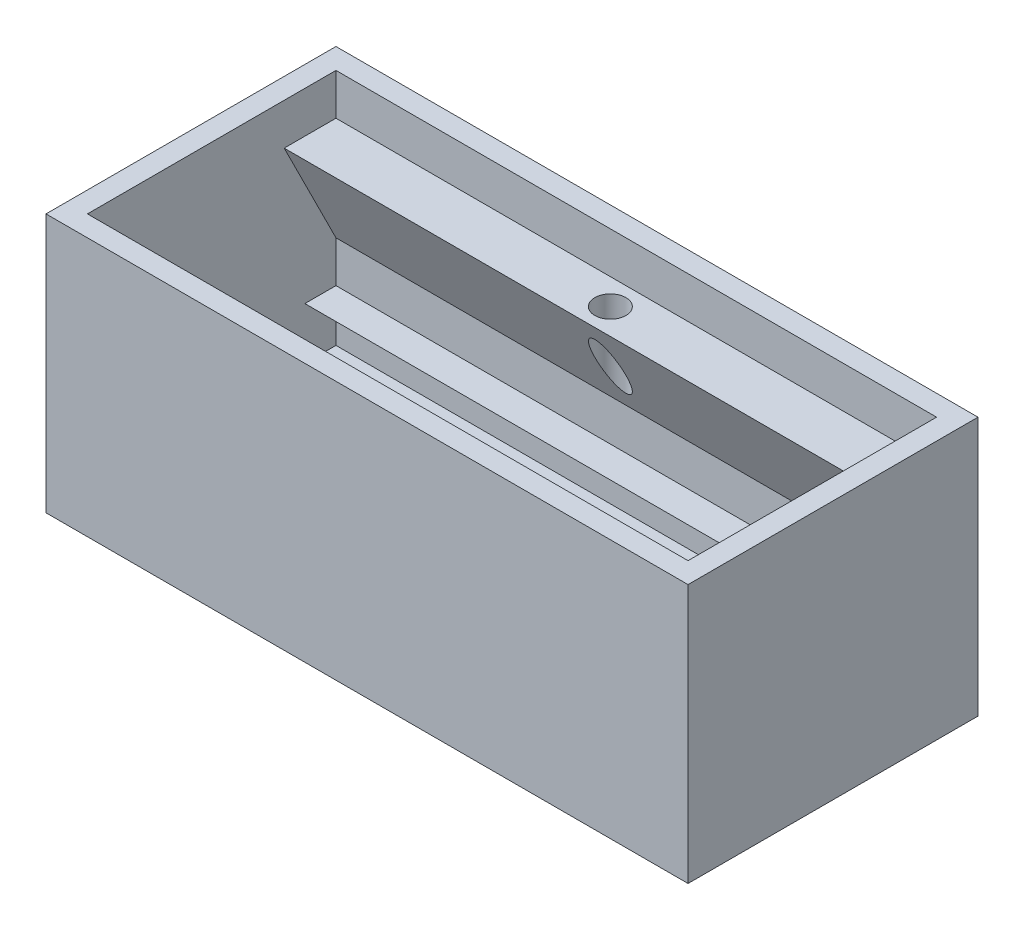
ISO-10303-21;
HEADER;
FILE_DESCRIPTION(('STEP AP214'),'2;1');
FILE_NAME('part.step','',(''),(''),'','','');
FILE_SCHEMA(('AUTOMOTIVE_DESIGN { 1 0 10303 214 1 1 1 1 }'));
ENDSEC;
DATA;
#1=APPLICATION_CONTEXT('core data for automotive mechanical design processes');
#2=APPLICATION_PROTOCOL_DEFINITION('international standard','automotive_design',2000,#1);
#3=PRODUCT_CONTEXT('',#1,'mechanical');
#4=PRODUCT('Part','Part','',(#3));
#5=PRODUCT_RELATED_PRODUCT_CATEGORY('part','',(#4));
#6=PRODUCT_DEFINITION_FORMATION('','',#4);
#7=PRODUCT_DEFINITION_CONTEXT('part definition',#1,'design');
#8=PRODUCT_DEFINITION('design','',#6,#7);
#9=PRODUCT_DEFINITION_SHAPE('','',#8);
#10=(LENGTH_UNIT() NAMED_UNIT(*) SI_UNIT(.MILLI.,.METRE.));
#11=(NAMED_UNIT(*) PLANE_ANGLE_UNIT() SI_UNIT($,.RADIAN.));
#12=(NAMED_UNIT(*) SI_UNIT($,.STERADIAN.) SOLID_ANGLE_UNIT());
#13=UNCERTAINTY_MEASURE_WITH_UNIT(LENGTH_MEASURE(1.E-05),#10,'distance_accuracy_value','');
#14=(GEOMETRIC_REPRESENTATION_CONTEXT(3) GLOBAL_UNCERTAINTY_ASSIGNED_CONTEXT((#13)) GLOBAL_UNIT_ASSIGNED_CONTEXT((#10,
#11,#12)) REPRESENTATION_CONTEXT('',''));
#15=CARTESIAN_POINT('',(0.,0.,0.));
#16=DIRECTION('',(0.,0.,1.));
#17=DIRECTION('',(1.,0.,0.));
#18=AXIS2_PLACEMENT_3D('',#15,#16,#17);
#19=CARTESIAN_POINT('',(2.,2.,-26.));
#20=DIRECTION('',(-1.,0.,0.));
#21=DIRECTION('',(0.,0.,1.));
#22=AXIS2_PLACEMENT_3D('',#19,#20,#21);
#23=PLANE('',#22);
#24=DIRECTION('',(0.,-0.707106781186548,-0.707106781186547));
#25=VECTOR('',#24,1.);
#26=CARTESIAN_POINT('',(2.,4.,-26.));
#27=LINE('',#26,#25);
#28=CARTESIAN_POINT('',(2.,7.,-23.));
#29=VERTEX_POINT('',#28);
#30=CARTESIAN_POINT('',(2.,4.00000000000001,-26.));
#31=VERTEX_POINT('',#30);
#32=EDGE_CURVE('E48',#29,#31,#27,.T.);
#33=ORIENTED_EDGE('',*,*,#32,.F.);
#34=DIRECTION('',(0.,0.,1.));
#35=VECTOR('',#34,1.);
#36=CARTESIAN_POINT('',(2.,7.,-23.));
#37=LINE('',#36,#35);
#38=CARTESIAN_POINT('',(2.,7.,-26.));
#39=VERTEX_POINT('',#38);
#40=EDGE_CURVE('E53',#39,#29,#37,.T.);
#41=ORIENTED_EDGE('',*,*,#40,.F.);
#42=DIRECTION('',(0.,1.,0.));
#43=VECTOR('',#42,1.);
#44=CARTESIAN_POINT('',(2.,2.,-26.));
#45=LINE('',#44,#43);
#46=CARTESIAN_POINT('',(2.,11.,-26.));
#47=VERTEX_POINT('',#46);
#48=EDGE_CURVE('E150',#39,#47,#45,.T.);
#49=ORIENTED_EDGE('',*,*,#48,.T.);
#50=DIRECTION('',(0.,-0.894427190999916,-0.447213595499958));
#51=VECTOR('',#50,1.);
#52=CARTESIAN_POINT('',(2.,11.,-26.));
#53=LINE('',#52,#51);
#54=CARTESIAN_POINT('',(2.,21.,-21.));
#55=VERTEX_POINT('',#54);
#56=EDGE_CURVE('E195',#55,#47,#53,.T.);
#57=ORIENTED_EDGE('',*,*,#56,.F.);
#58=DIRECTION('',(0.,0.,1.));
#59=VECTOR('',#58,1.);
#60=CARTESIAN_POINT('',(2.,21.,-21.));
#61=LINE('',#60,#59);
#62=CARTESIAN_POINT('',(2.,21.,-26.));
#63=VERTEX_POINT('',#62);
#64=EDGE_CURVE('E199',#63,#55,#61,.T.);
#65=ORIENTED_EDGE('',*,*,#64,.F.);
#66=CARTESIAN_POINT('',(2.,25.,-26.));
#67=VERTEX_POINT('',#66);
#68=EDGE_CURVE('E237',#63,#67,#45,.T.);
#69=ORIENTED_EDGE('',*,*,#68,.T.);
#70=DIRECTION('',(0.,0.,1.));
#71=VECTOR('',#70,1.);
#72=CARTESIAN_POINT('',(2.,25.,-26.));
#73=LINE('',#72,#71);
#74=CARTESIAN_POINT('',(2.,25.,-2.));
#75=VERTEX_POINT('',#74);
#76=EDGE_CURVE('E205',#67,#75,#73,.T.);
#77=ORIENTED_EDGE('',*,*,#76,.T.);
#78=DIRECTION('',(0.,1.,0.));
#79=VECTOR('',#78,1.);
#80=CARTESIAN_POINT('',(2.,2.,-2.));
#81=LINE('',#80,#79);
#82=CARTESIAN_POINT('',(2.,2.,-2.));
#83=VERTEX_POINT('',#82);
#84=EDGE_CURVE('E225',#83,#75,#81,.T.);
#85=ORIENTED_EDGE('',*,*,#84,.F.);
#86=DIRECTION('',(0.,0.,1.));
#87=VECTOR('',#86,1.);
#88=CARTESIAN_POINT('',(2.,2.,-26.));
#89=LINE('',#88,#87);
#90=CARTESIAN_POINT('',(2.,2.,-26.));
#91=VERTEX_POINT('',#90);
#92=EDGE_CURVE('E212',#91,#83,#89,.T.);
#93=ORIENTED_EDGE('',*,*,#92,.F.);
#94=EDGE_CURVE('E235',#91,#31,#45,.T.);
#95=ORIENTED_EDGE('',*,*,#94,.T.);
#96=EDGE_LOOP('',(#33,#41,#49,#57,#65,#69,#77,#85,#93,#95));
#97=FACE_BOUND('',#96,.T.);
#98=ADVANCED_FACE('F33',(#97),#23,.F.);
#99=CARTESIAN_POINT('',(2.,2.,-26.));
#100=DIRECTION('',(0.,0.,-1.));
#101=DIRECTION('',(-1.,0.,0.));
#102=AXIS2_PLACEMENT_3D('',#99,#100,#101);
#103=PLANE('',#102);
#104=DIRECTION('',(-1.,0.,0.));
#105=VECTOR('',#104,1.);
#106=CARTESIAN_POINT('',(500000.,4.,-26.0000000000632));
#107=LINE('',#106,#105);
#108=CARTESIAN_POINT('',(60.,4.00000000000001,-26.));
#109=VERTEX_POINT('',#108);
#110=EDGE_CURVE('E161',#109,#31,#107,.T.);
#111=ORIENTED_EDGE('',*,*,#110,.T.);
#112=ORIENTED_EDGE('',*,*,#94,.F.);
#113=DIRECTION('',(-1.,0.,0.));
#114=VECTOR('',#113,1.);
#115=CARTESIAN_POINT('',(2.,2.,-26.));
#116=LINE('',#115,#114);
#117=CARTESIAN_POINT('',(60.,2.,-26.));
#118=VERTEX_POINT('',#117);
#119=EDGE_CURVE('E222',#118,#91,#116,.T.);
#120=ORIENTED_EDGE('',*,*,#119,.F.);
#121=DIRECTION('',(0.,1.,0.));
#122=VECTOR('',#121,1.);
#123=CARTESIAN_POINT('',(60.,2.,-26.));
#124=LINE('',#123,#122);
#125=EDGE_CURVE('E144',#118,#109,#124,.T.);
#126=ORIENTED_EDGE('',*,*,#125,.T.);
#127=EDGE_LOOP('',(#111,#112,#120,#126));
#128=FACE_BOUND('',#127,.T.);
#129=ADVANCED_FACE('F296',(#128),#103,.F.);
#130=DIRECTION('',(-1.,0.,0.));
#131=VECTOR('',#130,1.);
#132=CARTESIAN_POINT('',(500000.,7.,-26.0000000000632));
#133=LINE('',#132,#131);
#134=CARTESIAN_POINT('',(60.000000000116,7.,-26.));
#135=VERTEX_POINT('',#134);
#136=EDGE_CURVE('E148',#135,#39,#133,.T.);
#137=ORIENTED_EDGE('',*,*,#136,.F.);
#138=CARTESIAN_POINT('',(60.,11.,-26.));
#139=VERTEX_POINT('',#138);
#140=EDGE_CURVE('E133',#135,#139,#124,.T.);
#141=ORIENTED_EDGE('',*,*,#140,.T.);
#142=DIRECTION('',(-1.,0.,0.));
#143=VECTOR('',#142,1.);
#144=CARTESIAN_POINT('',(71.1803398874989,11.,-26.));
#145=LINE('',#144,#143);
#146=EDGE_CURVE('E194',#139,#47,#145,.T.);
#147=ORIENTED_EDGE('',*,*,#146,.T.);
#148=ORIENTED_EDGE('',*,*,#48,.F.);
#149=EDGE_LOOP('',(#137,#141,#147,#148));
#150=FACE_BOUND('',#149,.T.);
#151=ADVANCED_FACE('F149',(#150),#103,.F.);
#152=CARTESIAN_POINT('',(60.,2.,-26.));
#153=DIRECTION('',(1.,0.,0.));
#154=DIRECTION('',(0.,0.,-1.));
#155=AXIS2_PLACEMENT_3D('',#152,#153,#154);
#156=PLANE('',#155);
#157=DIRECTION('',(0.,-0.707106781186548,-0.707106781186547));
#158=VECTOR('',#157,1.);
#159=CARTESIAN_POINT('',(60.0000000000023,3.99999999996838,-26.0000000000316));
#160=LINE('',#159,#158);
#161=CARTESIAN_POINT('',(60.,7.,-23.));
#162=VERTEX_POINT('',#161);
#163=EDGE_CURVE('E156',#162,#109,#160,.T.);
#164=ORIENTED_EDGE('',*,*,#163,.T.);
#165=ORIENTED_EDGE('',*,*,#125,.F.);
#166=DIRECTION('',(0.,0.,-1.));
#167=VECTOR('',#166,1.);
#168=CARTESIAN_POINT('',(60.,2.,-26.));
#169=LINE('',#168,#167);
#170=CARTESIAN_POINT('',(60.,2.,-2.));
#171=VERTEX_POINT('',#170);
#172=EDGE_CURVE('E219',#171,#118,#169,.T.);
#173=ORIENTED_EDGE('',*,*,#172,.F.);
#174=DIRECTION('',(0.,1.,0.));
#175=VECTOR('',#174,1.);
#176=CARTESIAN_POINT('',(60.,2.,-2.));
#177=LINE('',#176,#175);
#178=CARTESIAN_POINT('',(60.,25.,-2.));
#179=VERTEX_POINT('',#178);
#180=EDGE_CURVE('E240',#171,#179,#177,.T.);
#181=ORIENTED_EDGE('',*,*,#180,.T.);
#182=DIRECTION('',(0.,0.,-1.));
#183=VECTOR('',#182,1.);
#184=CARTESIAN_POINT('',(60.,25.,-26.));
#185=LINE('',#184,#183);
#186=CARTESIAN_POINT('',(60.,25.,-26.));
#187=VERTEX_POINT('',#186);
#188=EDGE_CURVE('E230',#179,#187,#185,.T.);
#189=ORIENTED_EDGE('',*,*,#188,.T.);
#190=CARTESIAN_POINT('',(60.,21.,-26.));
#191=VERTEX_POINT('',#190);
#192=EDGE_CURVE('E145',#191,#187,#124,.T.);
#193=ORIENTED_EDGE('',*,*,#192,.F.);
#194=DIRECTION('',(0.,0.,1.));
#195=VECTOR('',#194,1.);
#196=CARTESIAN_POINT('',(60.,21.,-21.));
#197=LINE('',#196,#195);
#198=CARTESIAN_POINT('',(60.,21.,-21.));
#199=VERTEX_POINT('',#198);
#200=EDGE_CURVE('E203',#191,#199,#197,.T.);
#201=ORIENTED_EDGE('',*,*,#200,.T.);
#202=DIRECTION('',(0.,-0.894427190999916,-0.447213595499958));
#203=VECTOR('',#202,1.);
#204=CARTESIAN_POINT('',(60.,11.,-26.));
#205=LINE('',#204,#203);
#206=EDGE_CURVE('E140',#199,#139,#205,.T.);
#207=ORIENTED_EDGE('',*,*,#206,.T.);
#208=ORIENTED_EDGE('',*,*,#140,.F.);
#209=DIRECTION('',(0.,0.,1.));
#210=VECTOR('',#209,1.);
#211=CARTESIAN_POINT('',(60.0000000000023,7.,-23.0000000000632));
#212=LINE('',#211,#210);
#213=EDGE_CURVE('E137',#135,#162,#212,.T.);
#214=ORIENTED_EDGE('',*,*,#213,.T.);
#215=EDGE_LOOP('',(#164,#165,#173,#181,#189,#193,#201,#207,#208,#214));
#216=FACE_BOUND('',#215,.T.);
#217=ADVANCED_FACE('F135',(#216),#156,.F.);
#218=DIRECTION('',(-1.,0.,0.));
#219=VECTOR('',#218,1.);
#220=CARTESIAN_POINT('',(71.1803398874989,21.,-26.));
#221=LINE('',#220,#219);
#222=EDGE_CURVE('E202',#191,#63,#221,.T.);
#223=ORIENTED_EDGE('',*,*,#222,.F.);
#224=ORIENTED_EDGE('',*,*,#192,.T.);
#225=DIRECTION('',(-1.,0.,0.));
#226=VECTOR('',#225,1.);
#227=CARTESIAN_POINT('',(2.,25.,-26.));
#228=LINE('',#227,#226);
#229=EDGE_CURVE('E216',#187,#67,#228,.T.);
#230=ORIENTED_EDGE('',*,*,#229,.T.);
#231=ORIENTED_EDGE('',*,*,#68,.F.);
#232=EDGE_LOOP('',(#223,#224,#230,#231));
#233=FACE_BOUND('',#232,.T.);
#234=ADVANCED_FACE('F294',(#233),#103,.F.);
#235=CARTESIAN_POINT('',(0.,25.,0.));
#236=DIRECTION('',(1.,0.,0.));
#237=DIRECTION('',(0.,0.,-1.));
#238=AXIS2_PLACEMENT_3D('',#235,#236,#237);
#239=PLANE('',#238);
#240=DIRECTION('',(0.,0.,1.));
#241=VECTOR('',#240,1.);
#242=CARTESIAN_POINT('',(0.,0.,0.));
#243=LINE('',#242,#241);
#244=CARTESIAN_POINT('',(0.,0.,-28.));
#245=VERTEX_POINT('',#244);
#246=CARTESIAN_POINT('',(0.,0.,0.));
#247=VERTEX_POINT('',#246);
#248=EDGE_CURVE('E236',#245,#247,#243,.T.);
#249=ORIENTED_EDGE('',*,*,#248,.T.);
#250=DIRECTION('',(0.,-1.,0.));
#251=VECTOR('',#250,1.);
#252=CARTESIAN_POINT('',(0.,25.,0.));
#253=LINE('',#252,#251);
#254=CARTESIAN_POINT('',(0.,25.,0.));
#255=VERTEX_POINT('',#254);
#256=EDGE_CURVE('E11',#255,#247,#253,.T.);
#257=ORIENTED_EDGE('',*,*,#256,.F.);
#258=DIRECTION('',(0.,0.,1.));
#259=VECTOR('',#258,1.);
#260=CARTESIAN_POINT('',(0.,25.,0.));
#261=LINE('',#260,#259);
#262=CARTESIAN_POINT('',(0.,25.,-28.));
#263=VERTEX_POINT('',#262);
#264=EDGE_CURVE('E244',#263,#255,#261,.T.);
#265=ORIENTED_EDGE('',*,*,#264,.F.);
#266=DIRECTION('',(0.,-1.,0.));
#267=VECTOR('',#266,1.);
#268=CARTESIAN_POINT('',(0.,25.,-28.));
#269=LINE('',#268,#267);
#270=EDGE_CURVE('E254',#263,#245,#269,.T.);
#271=ORIENTED_EDGE('',*,*,#270,.T.);
#272=EDGE_LOOP('',(#249,#257,#265,#271));
#273=FACE_BOUND('',#272,.T.);
#274=ADVANCED_FACE('F35',(#273),#239,.F.);
#275=CARTESIAN_POINT('',(0.,25.,0.));
#276=DIRECTION('',(0.,0.,-1.));
#277=DIRECTION('',(-1.,0.,0.));
#278=AXIS2_PLACEMENT_3D('',#275,#276,#277);
#279=PLANE('',#278);
#280=DIRECTION('',(1.,0.,0.));
#281=VECTOR('',#280,1.);
#282=CARTESIAN_POINT('',(0.,0.,0.));
#283=LINE('',#282,#281);
#284=CARTESIAN_POINT('',(62.,0.,0.));
#285=VERTEX_POINT('',#284);
#286=EDGE_CURVE('E257',#247,#285,#283,.T.);
#287=ORIENTED_EDGE('',*,*,#286,.T.);
#288=DIRECTION('',(0.,-1.,0.));
#289=VECTOR('',#288,1.);
#290=CARTESIAN_POINT('',(62.,25.,0.));
#291=LINE('',#290,#289);
#292=CARTESIAN_POINT('',(62.,25.,0.));
#293=VERTEX_POINT('',#292);
#294=EDGE_CURVE('E41',#293,#285,#291,.T.);
#295=ORIENTED_EDGE('',*,*,#294,.F.);
#296=DIRECTION('',(1.,0.,0.));
#297=VECTOR('',#296,1.);
#298=CARTESIAN_POINT('',(0.,25.,0.));
#299=LINE('',#298,#297);
#300=EDGE_CURVE('E247',#255,#293,#299,.T.);
#301=ORIENTED_EDGE('',*,*,#300,.F.);
#302=ORIENTED_EDGE('',*,*,#256,.T.);
#303=EDGE_LOOP('',(#287,#295,#301,#302));
#304=FACE_BOUND('',#303,.T.);
#305=ADVANCED_FACE('F287',(#304),#279,.F.);
#306=CARTESIAN_POINT('',(62.,25.,0.));
#307=DIRECTION('',(-1.,0.,0.));
#308=DIRECTION('',(0.,0.,1.));
#309=AXIS2_PLACEMENT_3D('',#306,#307,#308);
#310=PLANE('',#309);
#311=DIRECTION('',(0.,0.,-1.));
#312=VECTOR('',#311,1.);
#313=CARTESIAN_POINT('',(62.,0.,0.));
#314=LINE('',#313,#312);
#315=CARTESIAN_POINT('',(62.,0.,-28.));
#316=VERTEX_POINT('',#315);
#317=EDGE_CURVE('E259',#285,#316,#314,.T.);
#318=ORIENTED_EDGE('',*,*,#317,.T.);
#319=DIRECTION('',(0.,-1.,0.));
#320=VECTOR('',#319,1.);
#321=CARTESIAN_POINT('',(62.,25.,-28.));
#322=LINE('',#321,#320);
#323=CARTESIAN_POINT('',(62.,25.,-28.));
#324=VERTEX_POINT('',#323);
#325=EDGE_CURVE('E264',#324,#316,#322,.T.);
#326=ORIENTED_EDGE('',*,*,#325,.F.);
#327=DIRECTION('',(0.,0.,-1.));
#328=VECTOR('',#327,1.);
#329=CARTESIAN_POINT('',(62.,25.,0.));
#330=LINE('',#329,#328);
#331=EDGE_CURVE('E250',#293,#324,#330,.T.);
#332=ORIENTED_EDGE('',*,*,#331,.F.);
#333=ORIENTED_EDGE('',*,*,#294,.T.);
#334=EDGE_LOOP('',(#318,#326,#332,#333));
#335=FACE_BOUND('',#334,.T.);
#336=ADVANCED_FACE('F271',(#335),#310,.F.);
#337=CARTESIAN_POINT('',(0.,25.,-28.));
#338=DIRECTION('',(0.,0.,1.));
#339=DIRECTION('',(1.,0.,0.));
#340=AXIS2_PLACEMENT_3D('',#337,#338,#339);
#341=PLANE('',#340);
#342=DIRECTION('',(-1.,0.,0.));
#343=VECTOR('',#342,1.);
#344=CARTESIAN_POINT('',(0.,0.,-28.));
#345=LINE('',#344,#343);
#346=EDGE_CURVE('E248',#316,#245,#345,.T.);
#347=ORIENTED_EDGE('',*,*,#346,.T.);
#348=ORIENTED_EDGE('',*,*,#270,.F.);
#349=DIRECTION('',(-1.,0.,0.));
#350=VECTOR('',#349,1.);
#351=CARTESIAN_POINT('',(0.,25.,-28.));
#352=LINE('',#351,#350);
#353=EDGE_CURVE('E252',#324,#263,#352,.T.);
#354=ORIENTED_EDGE('',*,*,#353,.F.);
#355=ORIENTED_EDGE('',*,*,#325,.T.);
#356=EDGE_LOOP('',(#347,#348,#354,#355));
#357=FACE_BOUND('',#356,.T.);
#358=ADVANCED_FACE('F280',(#357),#341,.F.);
#359=CARTESIAN_POINT('',(0.,25.,0.));
#360=DIRECTION('',(0.,-1.,0.));
#361=DIRECTION('',(0.,0.,-1.));
#362=AXIS2_PLACEMENT_3D('',#359,#360,#361);
#363=PLANE('',#362);
#364=DIRECTION('',(1.,0.,0.));
#365=VECTOR('',#364,1.);
#366=CARTESIAN_POINT('',(2.,25.,-2.));
#367=LINE('',#366,#365);
#368=EDGE_CURVE('E227',#75,#179,#367,.T.);
#369=ORIENTED_EDGE('',*,*,#368,.F.);
#370=ORIENTED_EDGE('',*,*,#76,.F.);
#371=ORIENTED_EDGE('',*,*,#229,.F.);
#372=ORIENTED_EDGE('',*,*,#188,.F.);
#373=EDGE_LOOP('',(#369,#370,#371,#372));
#374=FACE_BOUND('',#373,.T.);
#375=ORIENTED_EDGE('',*,*,#264,.T.);
#376=ORIENTED_EDGE('',*,*,#300,.T.);
#377=ORIENTED_EDGE('',*,*,#331,.T.);
#378=ORIENTED_EDGE('',*,*,#353,.T.);
#379=EDGE_LOOP('',(#375,#376,#377,#378));
#380=FACE_BOUND('',#379,.T.);
#381=ADVANCED_FACE('F286',(#374,#380),#363,.F.);
#382=CARTESIAN_POINT('',(0.,0.,0.));
#383=DIRECTION('',(0.,-1.,0.));
#384=DIRECTION('',(0.,0.,-1.));
#385=AXIS2_PLACEMENT_3D('',#382,#383,#384);
#386=PLANE('',#385);
#387=CARTESIAN_POINT('',(40.,0.,-22.));
#388=DIRECTION('',(0.,-1.,0.));
#389=DIRECTION('',(0.,0.,-1.));
#390=AXIS2_PLACEMENT_3D('',#387,#388,#389);
#391=CIRCLE('',#390,1.75);
#392=CARTESIAN_POINT('',(40.,0.,-23.75));
#393=VERTEX_POINT('',#392);
#394=EDGE_CURVE('E164',#393,#393,#391,.T.);
#395=ORIENTED_EDGE('',*,*,#394,.F.);
#396=EDGE_LOOP('',(#395));
#397=FACE_BOUND('',#396,.T.);
#398=CARTESIAN_POINT('',(53.,0.,-21.));
#399=DIRECTION('',(0.,-1.,0.));
#400=DIRECTION('',(0.,0.,-1.));
#401=AXIS2_PLACEMENT_3D('',#398,#399,#400);
#402=CIRCLE('',#401,1.);
#403=CARTESIAN_POINT('',(53.,0.,-22.));
#404=VERTEX_POINT('',#403);
#405=EDGE_CURVE('E170',#404,#404,#402,.T.);
#406=ORIENTED_EDGE('',*,*,#405,.F.);
#407=EDGE_LOOP('',(#406));
#408=FACE_BOUND('',#407,.T.);
#409=CARTESIAN_POINT('',(7.5,0.,-7.5));
#410=DIRECTION('',(0.,-1.,0.));
#411=DIRECTION('',(0.,0.,-1.));
#412=AXIS2_PLACEMENT_3D('',#409,#410,#411);
#413=CIRCLE('',#412,0.750000000000001);
#414=CARTESIAN_POINT('',(7.5,0.,-8.25));
#415=VERTEX_POINT('',#414);
#416=EDGE_CURVE('E176',#415,#415,#413,.T.);
#417=ORIENTED_EDGE('',*,*,#416,.F.);
#418=EDGE_LOOP('',(#417));
#419=FACE_BOUND('',#418,.T.);
#420=CARTESIAN_POINT('',(5.5,0.,-7.5));
#421=DIRECTION('',(0.,-1.,0.));
#422=DIRECTION('',(0.,0.,-1.));
#423=AXIS2_PLACEMENT_3D('',#420,#421,#422);
#424=CIRCLE('',#423,0.75);
#425=CARTESIAN_POINT('',(5.5,0.,-8.25));
#426=VERTEX_POINT('',#425);
#427=EDGE_CURVE('E182',#426,#426,#424,.T.);
#428=ORIENTED_EDGE('',*,*,#427,.F.);
#429=EDGE_LOOP('',(#428));
#430=FACE_BOUND('',#429,.T.);
#431=CARTESIAN_POINT('',(3.5,0.,-7.5));
#432=DIRECTION('',(0.,-1.,0.));
#433=DIRECTION('',(0.,0.,-1.));
#434=AXIS2_PLACEMENT_3D('',#431,#432,#433);
#435=CIRCLE('',#434,0.75);
#436=CARTESIAN_POINT('',(3.5,0.,-8.25));
#437=VERTEX_POINT('',#436);
#438=EDGE_CURVE('E188',#437,#437,#435,.T.);
#439=ORIENTED_EDGE('',*,*,#438,.F.);
#440=EDGE_LOOP('',(#439));
#441=FACE_BOUND('',#440,.T.);
#442=ORIENTED_EDGE('',*,*,#248,.F.);
#443=ORIENTED_EDGE('',*,*,#346,.F.);
#444=ORIENTED_EDGE('',*,*,#317,.F.);
#445=ORIENTED_EDGE('',*,*,#286,.F.);
#446=EDGE_LOOP('',(#442,#443,#444,#445));
#447=FACE_BOUND('',#446,.T.);
#448=ADVANCED_FACE('F277',(#397,#408,#419,#430,#441,#447),#386,.T.);
#449=CARTESIAN_POINT('',(2.,2.,-2.));
#450=DIRECTION('',(0.,0.,1.));
#451=DIRECTION('',(1.,0.,0.));
#452=AXIS2_PLACEMENT_3D('',#449,#450,#451);
#453=PLANE('',#452);
#454=ORIENTED_EDGE('',*,*,#368,.T.);
#455=ORIENTED_EDGE('',*,*,#180,.F.);
#456=DIRECTION('',(1.,0.,0.));
#457=VECTOR('',#456,1.);
#458=CARTESIAN_POINT('',(2.,2.,-2.));
#459=LINE('',#458,#457);
#460=EDGE_CURVE('E215',#83,#171,#459,.T.);
#461=ORIENTED_EDGE('',*,*,#460,.F.);
#462=ORIENTED_EDGE('',*,*,#84,.T.);
#463=EDGE_LOOP('',(#454,#455,#461,#462));
#464=FACE_BOUND('',#463,.T.);
#465=ADVANCED_FACE('F306',(#464),#453,.F.);
#466=CARTESIAN_POINT('',(0.,2.,0.));
#467=DIRECTION('',(0.,1.,0.));
#468=DIRECTION('',(0.,0.,1.));
#469=AXIS2_PLACEMENT_3D('',#466,#467,#468);
#470=PLANE('',#469);
#471=CARTESIAN_POINT('',(40.,2.,-22.));
#472=DIRECTION('',(0.,1.,0.));
#473=DIRECTION('',(0.,0.,1.));
#474=AXIS2_PLACEMENT_3D('',#471,#472,#473);
#475=CIRCLE('',#474,1.75);
#476=CARTESIAN_POINT('',(40.,2.,-20.25));
#477=VERTEX_POINT('',#476);
#478=EDGE_CURVE('E167',#477,#477,#475,.T.);
#479=ORIENTED_EDGE('',*,*,#478,.F.);
#480=EDGE_LOOP('',(#479));
#481=FACE_BOUND('',#480,.T.);
#482=CARTESIAN_POINT('',(53.,2.,-21.));
#483=DIRECTION('',(0.,1.,0.));
#484=DIRECTION('',(0.,0.,1.));
#485=AXIS2_PLACEMENT_3D('',#482,#483,#484);
#486=CIRCLE('',#485,1.);
#487=CARTESIAN_POINT('',(53.,2.,-20.));
#488=VERTEX_POINT('',#487);
#489=EDGE_CURVE('E173',#488,#488,#486,.T.);
#490=ORIENTED_EDGE('',*,*,#489,.F.);
#491=EDGE_LOOP('',(#490));
#492=FACE_BOUND('',#491,.T.);
#493=CARTESIAN_POINT('',(7.5,2.,-7.5));
#494=DIRECTION('',(0.,1.,0.));
#495=DIRECTION('',(0.,0.,1.));
#496=AXIS2_PLACEMENT_3D('',#493,#494,#495);
#497=CIRCLE('',#496,0.75);
#498=CARTESIAN_POINT('',(7.5,2.,-6.75));
#499=VERTEX_POINT('',#498);
#500=EDGE_CURVE('E179',#499,#499,#497,.T.);
#501=ORIENTED_EDGE('',*,*,#500,.F.);
#502=EDGE_LOOP('',(#501));
#503=FACE_BOUND('',#502,.T.);
#504=CARTESIAN_POINT('',(5.5,2.,-7.5));
#505=DIRECTION('',(0.,1.,0.));
#506=DIRECTION('',(0.,0.,1.));
#507=AXIS2_PLACEMENT_3D('',#504,#505,#506);
#508=CIRCLE('',#507,0.75);
#509=CARTESIAN_POINT('',(5.5,2.,-6.75));
#510=VERTEX_POINT('',#509);
#511=EDGE_CURVE('E185',#510,#510,#508,.T.);
#512=ORIENTED_EDGE('',*,*,#511,.F.);
#513=EDGE_LOOP('',(#512));
#514=FACE_BOUND('',#513,.T.);
#515=CARTESIAN_POINT('',(3.5,2.,-7.5));
#516=DIRECTION('',(0.,1.,0.));
#517=DIRECTION('',(0.,0.,1.));
#518=AXIS2_PLACEMENT_3D('',#515,#516,#517);
#519=CIRCLE('',#518,0.75);
#520=CARTESIAN_POINT('',(3.5,2.,-6.75));
#521=VERTEX_POINT('',#520);
#522=EDGE_CURVE('E191',#521,#521,#519,.T.);
#523=ORIENTED_EDGE('',*,*,#522,.F.);
#524=EDGE_LOOP('',(#523));
#525=FACE_BOUND('',#524,.T.);
#526=ORIENTED_EDGE('',*,*,#92,.T.);
#527=ORIENTED_EDGE('',*,*,#460,.T.);
#528=ORIENTED_EDGE('',*,*,#172,.T.);
#529=ORIENTED_EDGE('',*,*,#119,.T.);
#530=EDGE_LOOP('',(#526,#527,#528,#529));
#531=FACE_BOUND('',#530,.T.);
#532=ADVANCED_FACE('F338',(#481,#492,#503,#514,#525,#531),#470,.T.);
#533=CARTESIAN_POINT('',(71.1803398874989,21.,-21.));
#534=DIRECTION('',(0.,-1.,0.));
#535=DIRECTION('',(0.,0.,-1.));
#536=AXIS2_PLACEMENT_3D('',#533,#534,#535);
#537=PLANE('',#536);
#538=CARTESIAN_POINT('',(31.,21.,-23.5));
#539=DIRECTION('',(0.,1.,0.));
#540=DIRECTION('',(0.,0.,1.));
#541=AXIS2_PLACEMENT_3D('',#538,#539,#540);
#542=CIRCLE('',#541,1.49999999999999);
#543=CARTESIAN_POINT('',(31.,21.,-22.));
#544=VERTEX_POINT('',#543);
#545=EDGE_CURVE('E466',#544,#544,#542,.T.);
#546=ORIENTED_EDGE('',*,*,#545,.F.);
#547=EDGE_LOOP('',(#546));
#548=FACE_BOUND('',#547,.T.);
#549=ORIENTED_EDGE('',*,*,#200,.F.);
#550=ORIENTED_EDGE('',*,*,#222,.T.);
#551=ORIENTED_EDGE('',*,*,#64,.T.);
#552=DIRECTION('',(-1.,0.,0.));
#553=VECTOR('',#552,1.);
#554=CARTESIAN_POINT('',(71.1803398874989,21.,-21.));
#555=LINE('',#554,#553);
#556=EDGE_CURVE('E198',#199,#55,#555,.T.);
#557=ORIENTED_EDGE('',*,*,#556,.F.);
#558=EDGE_LOOP('',(#549,#550,#551,#557));
#559=FACE_BOUND('',#558,.T.);
#560=ADVANCED_FACE('F345',(#548,#559),#537,.F.);
#561=CARTESIAN_POINT('',(71.1803398874989,11.,-26.));
#562=DIRECTION('',(0.,0.447213595499958,-0.894427190999916));
#563=DIRECTION('',(0.,0.894427190999916,0.447213595499958));
#564=AXIS2_PLACEMENT_3D('',#561,#562,#563);
#565=PLANE('',#564);
#566=CARTESIAN_POINT('',(31.,16.,-23.5));
#567=DIRECTION('',(0.,0.447213595499958,-0.894427190999916));
#568=DIRECTION('',(0.,0.894427190999916,0.447213595499958));
#569=AXIS2_PLACEMENT_3D('',#566,#567,#568);
#570=ELLIPSE('',#569,3.35410196624967,1.49999999999999);
#571=CARTESIAN_POINT('',(31.,19.,-22.));
#572=VERTEX_POINT('',#571);
#573=EDGE_CURVE('E158',#572,#572,#570,.T.);
#574=ORIENTED_EDGE('',*,*,#573,.T.);
#575=EDGE_LOOP('',(#574));
#576=FACE_BOUND('',#575,.T.);
#577=ORIENTED_EDGE('',*,*,#206,.F.);
#578=ORIENTED_EDGE('',*,*,#556,.T.);
#579=ORIENTED_EDGE('',*,*,#56,.T.);
#580=ORIENTED_EDGE('',*,*,#146,.F.);
#581=EDGE_LOOP('',(#577,#578,#579,#580));
#582=FACE_BOUND('',#581,.T.);
#583=ADVANCED_FACE('F388',(#576,#582),#565,.F.);
#584=CARTESIAN_POINT('',(3.5,0.,-7.5));
#585=DIRECTION('',(0.,-1.,0.));
#586=DIRECTION('',(0.,0.,-1.));
#587=AXIS2_PLACEMENT_3D('',#584,#585,#586);
#588=CYLINDRICAL_SURFACE('',#587,0.75);
#589=ORIENTED_EDGE('',*,*,#438,.T.);
#590=EDGE_LOOP('',(#589));
#591=FACE_BOUND('',#590,.T.);
#592=ORIENTED_EDGE('',*,*,#522,.T.);
#593=EDGE_LOOP('',(#592));
#594=FACE_BOUND('',#593,.T.);
#595=ADVANCED_FACE('F396',(#591,#594),#588,.F.);
#596=CARTESIAN_POINT('',(5.5,0.,-7.5));
#597=DIRECTION('',(0.,-1.,0.));
#598=DIRECTION('',(0.,0.,-1.));
#599=AXIS2_PLACEMENT_3D('',#596,#597,#598);
#600=CYLINDRICAL_SURFACE('',#599,0.75);
#601=ORIENTED_EDGE('',*,*,#427,.T.);
#602=EDGE_LOOP('',(#601));
#603=FACE_BOUND('',#602,.T.);
#604=ORIENTED_EDGE('',*,*,#511,.T.);
#605=EDGE_LOOP('',(#604));
#606=FACE_BOUND('',#605,.T.);
#607=ADVANCED_FACE('F405',(#603,#606),#600,.F.);
#608=CARTESIAN_POINT('',(7.5,0.,-7.5));
#609=DIRECTION('',(0.,-1.,0.));
#610=DIRECTION('',(0.,0.,-1.));
#611=AXIS2_PLACEMENT_3D('',#608,#609,#610);
#612=CYLINDRICAL_SURFACE('',#611,0.75);
#613=ORIENTED_EDGE('',*,*,#416,.T.);
#614=EDGE_LOOP('',(#613));
#615=FACE_BOUND('',#614,.T.);
#616=ORIENTED_EDGE('',*,*,#500,.T.);
#617=EDGE_LOOP('',(#616));
#618=FACE_BOUND('',#617,.T.);
#619=ADVANCED_FACE('F413',(#615,#618),#612,.F.);
#620=CARTESIAN_POINT('',(53.,0.,-21.));
#621=DIRECTION('',(0.,-1.,0.));
#622=DIRECTION('',(0.,0.,-1.));
#623=AXIS2_PLACEMENT_3D('',#620,#621,#622);
#624=CYLINDRICAL_SURFACE('',#623,1.);
#625=ORIENTED_EDGE('',*,*,#405,.T.);
#626=EDGE_LOOP('',(#625));
#627=FACE_BOUND('',#626,.T.);
#628=ORIENTED_EDGE('',*,*,#489,.T.);
#629=EDGE_LOOP('',(#628));
#630=FACE_BOUND('',#629,.T.);
#631=ADVANCED_FACE('F421',(#627,#630),#624,.F.);
#632=CARTESIAN_POINT('',(40.,0.,-22.));
#633=DIRECTION('',(0.,-1.,0.));
#634=DIRECTION('',(0.,0.,-1.));
#635=AXIS2_PLACEMENT_3D('',#632,#633,#634);
#636=CYLINDRICAL_SURFACE('',#635,1.75);
#637=ORIENTED_EDGE('',*,*,#394,.T.);
#638=EDGE_LOOP('',(#637));
#639=FACE_BOUND('',#638,.T.);
#640=ORIENTED_EDGE('',*,*,#478,.T.);
#641=EDGE_LOOP('',(#640));
#642=FACE_BOUND('',#641,.T.);
#643=ADVANCED_FACE('F428',(#639,#642),#636,.F.);
#644=CARTESIAN_POINT('',(500000.,4.,-26.0000000000632));
#645=DIRECTION('',(0.,0.707106781186547,-0.707106781186548));
#646=DIRECTION('',(0.,0.707106781186548,0.707106781186547));
#647=AXIS2_PLACEMENT_3D('',#644,#645,#646);
#648=PLANE('',#647);
#649=ORIENTED_EDGE('',*,*,#163,.F.);
#650=DIRECTION('',(-1.,0.,0.));
#651=VECTOR('',#650,1.);
#652=CARTESIAN_POINT('',(500000.,7.,-23.0000000000632));
#653=LINE('',#652,#651);
#654=EDGE_CURVE('E152',#162,#29,#653,.T.);
#655=ORIENTED_EDGE('',*,*,#654,.T.);
#656=ORIENTED_EDGE('',*,*,#32,.T.);
#657=ORIENTED_EDGE('',*,*,#110,.F.);
#658=EDGE_LOOP('',(#649,#655,#656,#657));
#659=FACE_BOUND('',#658,.T.);
#660=ADVANCED_FACE('F435',(#659),#648,.F.);
#661=CARTESIAN_POINT('',(500000.,7.,-23.0000000000632));
#662=DIRECTION('',(0.,-1.,0.));
#663=DIRECTION('',(0.,0.,-1.));
#664=AXIS2_PLACEMENT_3D('',#661,#662,#663);
#665=PLANE('',#664);
#666=ORIENTED_EDGE('',*,*,#213,.F.);
#667=ORIENTED_EDGE('',*,*,#136,.T.);
#668=ORIENTED_EDGE('',*,*,#40,.T.);
#669=ORIENTED_EDGE('',*,*,#654,.F.);
#670=EDGE_LOOP('',(#666,#667,#668,#669));
#671=FACE_BOUND('',#670,.T.);
#672=ADVANCED_FACE('F155',(#671),#665,.F.);
#673=CARTESIAN_POINT('',(31.,21.,-23.5));
#674=DIRECTION('',(0.,1.,0.));
#675=DIRECTION('',(0.,0.,1.));
#676=AXIS2_PLACEMENT_3D('',#673,#674,#675);
#677=CYLINDRICAL_SURFACE('',#676,1.49999999999999);
#678=ORIENTED_EDGE('',*,*,#573,.F.);
#679=EDGE_LOOP('',(#678));
#680=FACE_BOUND('',#679,.T.);
#681=ORIENTED_EDGE('',*,*,#545,.T.);
#682=EDGE_LOOP('',(#681));
#683=FACE_BOUND('',#682,.T.);
#684=ADVANCED_FACE('F443',(#680,#683),#677,.F.);
#685=CLOSED_SHELL('',(#98,#129,#151,#217,#234,#274,#305,#336,#358,#381,#448,#465,#532,#560,#583,
#595,#607,#619,#631,#643,#660,#672,#684));
#686=MANIFOLD_SOLID_BREP('B2',#685);
#687=ADVANCED_BREP_SHAPE_REPRESENTATION('',(#18,#686),#14);
#688=SHAPE_DEFINITION_REPRESENTATION(#9,#687);
ENDSEC;
END-ISO-10303-21;
